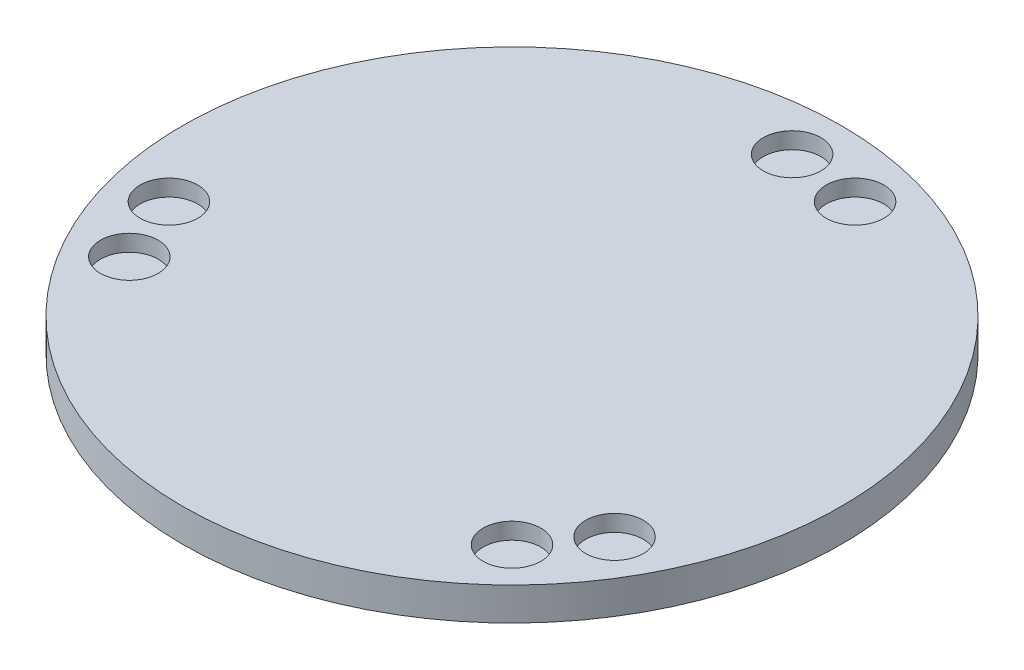
ISO-10303-21;
HEADER;
FILE_DESCRIPTION(('STEP AP214'),'2;1');
FILE_NAME('part.step','',(''),(''),'','','');
FILE_SCHEMA(('AUTOMOTIVE_DESIGN { 1 0 10303 214 1 1 1 1 }'));
ENDSEC;
DATA;
#1=APPLICATION_CONTEXT('core data for automotive mechanical design processes');
#2=APPLICATION_PROTOCOL_DEFINITION('international standard','automotive_design',2000,#1);
#3=PRODUCT_CONTEXT('',#1,'mechanical');
#4=PRODUCT('Part','Part','',(#3));
#5=PRODUCT_RELATED_PRODUCT_CATEGORY('part','',(#4));
#6=PRODUCT_DEFINITION_FORMATION('','',#4);
#7=PRODUCT_DEFINITION_CONTEXT('part definition',#1,'design');
#8=PRODUCT_DEFINITION('design','',#6,#7);
#9=PRODUCT_DEFINITION_SHAPE('','',#8);
#10=(LENGTH_UNIT() NAMED_UNIT(*) SI_UNIT(.MILLI.,.METRE.));
#11=(NAMED_UNIT(*) PLANE_ANGLE_UNIT() SI_UNIT($,.RADIAN.));
#12=(NAMED_UNIT(*) SI_UNIT($,.STERADIAN.) SOLID_ANGLE_UNIT());
#13=UNCERTAINTY_MEASURE_WITH_UNIT(LENGTH_MEASURE(1.E-05),#10,'distance_accuracy_value','');
#14=(GEOMETRIC_REPRESENTATION_CONTEXT(3) GLOBAL_UNCERTAINTY_ASSIGNED_CONTEXT((#13)) GLOBAL_UNIT_ASSIGNED_CONTEXT((#10,
#11,#12)) REPRESENTATION_CONTEXT('',''));
#15=CARTESIAN_POINT('',(0.,0.,0.));
#16=DIRECTION('',(0.,0.,1.));
#17=DIRECTION('',(1.,0.,0.));
#18=AXIS2_PLACEMENT_3D('',#15,#16,#17);
#19=CARTESIAN_POINT('',(0.,-20.,0.));
#20=DIRECTION('',(0.,1.,0.));
#21=DIRECTION('',(0.,0.,1.));
#22=AXIS2_PLACEMENT_3D('',#19,#20,#21);
#23=CYLINDRICAL_SURFACE('',#22,200.);
#24=CARTESIAN_POINT('',(0.,-20.,0.));
#25=DIRECTION('',(0.,1.,0.));
#26=DIRECTION('',(0.,0.,1.));
#27=AXIS2_PLACEMENT_3D('',#24,#25,#26);
#28=CIRCLE('',#27,200.);
#29=CARTESIAN_POINT('',(0.,-20.,200.));
#30=VERTEX_POINT('',#29);
#31=EDGE_CURVE('E11',#30,#30,#28,.T.);
#32=ORIENTED_EDGE('',*,*,#31,.T.);
#33=EDGE_LOOP('',(#32));
#34=FACE_BOUND('',#33,.T.);
#35=CARTESIAN_POINT('',(0.,0.,0.));
#36=DIRECTION('',(0.,1.,0.));
#37=DIRECTION('',(0.,0.,1.));
#38=AXIS2_PLACEMENT_3D('',#35,#36,#37);
#39=CIRCLE('',#38,200.);
#40=CARTESIAN_POINT('',(0.,0.,200.));
#41=VERTEX_POINT('',#40);
#42=EDGE_CURVE('E42',#41,#41,#39,.T.);
#43=ORIENTED_EDGE('',*,*,#42,.F.);
#44=EDGE_LOOP('',(#43));
#45=FACE_BOUND('',#44,.T.);
#46=ADVANCED_FACE('F39',(#34,#45),#23,.T.);
#47=CARTESIAN_POINT('',(0.,-20.,0.));
#48=DIRECTION('',(0.,1.,0.));
#49=DIRECTION('',(0.,0.,1.));
#50=AXIS2_PLACEMENT_3D('',#47,#48,#49);
#51=PLANE('',#50);
#52=ORIENTED_EDGE('',*,*,#31,.F.);
#53=EDGE_LOOP('',(#52));
#54=FACE_BOUND('',#53,.T.);
#55=ADVANCED_FACE('F100',(#54),#51,.F.);
#56=CARTESIAN_POINT('',(0.,0.,0.));
#57=DIRECTION('',(0.,1.,0.));
#58=DIRECTION('',(0.,0.,1.));
#59=AXIS2_PLACEMENT_3D('',#56,#57,#58);
#60=PLANE('',#59);
#61=CARTESIAN_POINT('',(-164.207390469139,0.,43.999237667431));
#62=DIRECTION('',(0.,1.,0.));
#63=DIRECTION('',(0.,0.,1.));
#64=AXIS2_PLACEMENT_3D('',#61,#62,#63);
#65=CIRCLE('',#64,17.5000000000053);
#66=CARTESIAN_POINT('',(-164.207390469139,0.,61.4992376674363));
#67=VERTEX_POINT('',#66);
#68=EDGE_CURVE('E90',#67,#67,#65,.T.);
#69=ORIENTED_EDGE('',*,*,#68,.F.);
#70=EDGE_LOOP('',(#69));
#71=FACE_BOUND('',#70,.T.);
#72=CARTESIAN_POINT('',(-147.224318643351,0.,85.0000000000026));
#73=DIRECTION('',(0.,1.,0.));
#74=DIRECTION('',(0.,0.,1.));
#75=AXIS2_PLACEMENT_3D('',#72,#73,#74);
#76=CIRCLE('',#75,17.5000000000055);
#77=CARTESIAN_POINT('',(-147.224318643351,0.,102.500000000008));
#78=VERTEX_POINT('',#77);
#79=EDGE_CURVE('E83',#78,#78,#76,.T.);
#80=ORIENTED_EDGE('',*,*,#79,.F.);
#81=EDGE_LOOP('',(#80));
#82=FACE_BOUND('',#81,.T.);
#83=CARTESIAN_POINT('',(120.208152801717,0.,120.208152801712));
#84=DIRECTION('',(0.,1.,0.));
#85=DIRECTION('',(0.,0.,1.));
#86=AXIS2_PLACEMENT_3D('',#83,#84,#85);
#87=CIRCLE('',#86,17.5000000000053);
#88=CARTESIAN_POINT('',(120.208152801717,0.,137.708152801717));
#89=VERTEX_POINT('',#88);
#90=EDGE_CURVE('E76',#89,#89,#87,.T.);
#91=ORIENTED_EDGE('',*,*,#90,.F.);
#92=EDGE_LOOP('',(#91));
#93=FACE_BOUND('',#92,.T.);
#94=CARTESIAN_POINT('',(147.224318643358,0.,84.9999999999985));
#95=DIRECTION('',(0.,1.,0.));
#96=DIRECTION('',(0.,0.,1.));
#97=AXIS2_PLACEMENT_3D('',#94,#95,#96);
#98=CIRCLE('',#97,17.5000000000031);
#99=CARTESIAN_POINT('',(147.224318643358,0.,102.500000000002));
#100=VERTEX_POINT('',#99);
#101=EDGE_CURVE('E69',#100,#100,#98,.T.);
#102=ORIENTED_EDGE('',*,*,#101,.F.);
#103=EDGE_LOOP('',(#102));
#104=FACE_BOUND('',#103,.T.);
#105=CARTESIAN_POINT('',(43.9992376674287,0.,-164.207390469142));
#106=DIRECTION('',(0.,1.,0.));
#107=DIRECTION('',(0.,0.,1.));
#108=AXIS2_PLACEMENT_3D('',#105,#106,#107);
#109=CIRCLE('',#108,17.5000000000053);
#110=CARTESIAN_POINT('',(43.9992376674287,0.,-146.707390469136));
#111=VERTEX_POINT('',#110);
#112=EDGE_CURVE('E62',#111,#111,#109,.T.);
#113=ORIENTED_EDGE('',*,*,#112,.F.);
#114=EDGE_LOOP('',(#113));
#115=FACE_BOUND('',#114,.T.);
#116=CARTESIAN_POINT('',(0.,0.,-170.));
#117=DIRECTION('',(0.,1.,0.));
#118=DIRECTION('',(0.,0.,1.));
#119=AXIS2_PLACEMENT_3D('',#116,#117,#118);
#120=CIRCLE('',#119,17.5);
#121=CARTESIAN_POINT('',(0.,0.,-152.5));
#122=VERTEX_POINT('',#121);
#123=EDGE_CURVE('E55',#122,#122,#120,.T.);
#124=ORIENTED_EDGE('',*,*,#123,.F.);
#125=EDGE_LOOP('',(#124));
#126=FACE_BOUND('',#125,.T.);
#127=ORIENTED_EDGE('',*,*,#42,.T.);
#128=EDGE_LOOP('',(#127));
#129=FACE_BOUND('',#128,.T.);
#130=ADVANCED_FACE('F96',(#71,#82,#93,#104,#115,#126,#129),#60,.T.);
#131=CARTESIAN_POINT('',(0.,-69.497474683074,-170.));
#132=DIRECTION('',(0.,1.,0.));
#133=DIRECTION('',(0.,0.,1.));
#134=AXIS2_PLACEMENT_3D('',#131,#132,#133);
#135=CYLINDRICAL_SURFACE('',#134,17.5);
#136=CARTESIAN_POINT('',(0.,-10.,-170.));
#137=DIRECTION('',(0.,1.,0.));
#138=DIRECTION('',(0.,0.,1.));
#139=AXIS2_PLACEMENT_3D('',#136,#137,#138);
#140=CIRCLE('',#139,17.5);
#141=CARTESIAN_POINT('',(0.,-10.,-152.5));
#142=VERTEX_POINT('',#141);
#143=EDGE_CURVE('E50',#142,#142,#140,.F.);
#144=ORIENTED_EDGE('',*,*,#143,.T.);
#145=EDGE_LOOP('',(#144));
#146=FACE_BOUND('',#145,.T.);
#147=ORIENTED_EDGE('',*,*,#123,.T.);
#148=EDGE_LOOP('',(#147));
#149=FACE_BOUND('',#148,.T.);
#150=ADVANCED_FACE('F99',(#146,#149),#135,.F.);
#151=CARTESIAN_POINT('',(0.,-10.,0.));
#152=DIRECTION('',(0.,1.,0.));
#153=DIRECTION('',(0.,0.,1.));
#154=AXIS2_PLACEMENT_3D('',#151,#152,#153);
#155=PLANE('',#154);
#156=ORIENTED_EDGE('',*,*,#143,.F.);
#157=EDGE_LOOP('',(#156));
#158=FACE_BOUND('',#157,.T.);
#159=ADVANCED_FACE('F124',(#158),#155,.T.);
#160=CARTESIAN_POINT('',(43.9992376674287,-69.497474683074,-164.207390469142));
#161=DIRECTION('',(0.,1.,0.));
#162=DIRECTION('',(0.,0.,1.));
#163=AXIS2_PLACEMENT_3D('',#160,#161,#162);
#164=CYLINDRICAL_SURFACE('',#163,17.5000000000053);
#165=CARTESIAN_POINT('',(43.9992376674287,-10.,-164.207390469142));
#166=DIRECTION('',(0.,1.,0.));
#167=DIRECTION('',(0.,0.,1.));
#168=AXIS2_PLACEMENT_3D('',#165,#166,#167);
#169=CIRCLE('',#168,17.5000000000053);
#170=CARTESIAN_POINT('',(43.9992376674287,-10.,-146.707390469136));
#171=VERTEX_POINT('',#170);
#172=EDGE_CURVE('E58',#171,#171,#169,.F.);
#173=ORIENTED_EDGE('',*,*,#172,.T.);
#174=EDGE_LOOP('',(#173));
#175=FACE_BOUND('',#174,.T.);
#176=ORIENTED_EDGE('',*,*,#112,.T.);
#177=EDGE_LOOP('',(#176));
#178=FACE_BOUND('',#177,.T.);
#179=ADVANCED_FACE('F128',(#175,#178),#164,.F.);
#180=CARTESIAN_POINT('',(0.,-10.,0.));
#181=DIRECTION('',(0.,1.,0.));
#182=DIRECTION('',(0.,0.,1.));
#183=AXIS2_PLACEMENT_3D('',#180,#181,#182);
#184=PLANE('',#183);
#185=ORIENTED_EDGE('',*,*,#172,.F.);
#186=EDGE_LOOP('',(#185));
#187=FACE_BOUND('',#186,.T.);
#188=ADVANCED_FACE('F132',(#187),#184,.T.);
#189=CARTESIAN_POINT('',(147.224318643358,-69.497474683074,84.9999999999985));
#190=DIRECTION('',(0.,1.,0.));
#191=DIRECTION('',(0.,0.,1.));
#192=AXIS2_PLACEMENT_3D('',#189,#190,#191);
#193=CYLINDRICAL_SURFACE('',#192,17.5000000000031);
#194=CARTESIAN_POINT('',(147.224318643358,-10.,84.9999999999985));
#195=DIRECTION('',(0.,1.,0.));
#196=DIRECTION('',(0.,0.,1.));
#197=AXIS2_PLACEMENT_3D('',#194,#195,#196);
#198=CIRCLE('',#197,17.5000000000031);
#199=CARTESIAN_POINT('',(147.224318643358,-10.,102.500000000002));
#200=VERTEX_POINT('',#199);
#201=EDGE_CURVE('E65',#200,#200,#198,.F.);
#202=ORIENTED_EDGE('',*,*,#201,.T.);
#203=EDGE_LOOP('',(#202));
#204=FACE_BOUND('',#203,.T.);
#205=ORIENTED_EDGE('',*,*,#101,.T.);
#206=EDGE_LOOP('',(#205));
#207=FACE_BOUND('',#206,.T.);
#208=ADVANCED_FACE('F136',(#204,#207),#193,.F.);
#209=CARTESIAN_POINT('',(0.,-10.,0.));
#210=DIRECTION('',(0.,1.,0.));
#211=DIRECTION('',(0.,0.,1.));
#212=AXIS2_PLACEMENT_3D('',#209,#210,#211);
#213=PLANE('',#212);
#214=ORIENTED_EDGE('',*,*,#201,.F.);
#215=EDGE_LOOP('',(#214));
#216=FACE_BOUND('',#215,.T.);
#217=ADVANCED_FACE('F140',(#216),#213,.T.);
#218=CARTESIAN_POINT('',(120.208152801717,-69.497474683074,120.208152801712));
#219=DIRECTION('',(0.,1.,0.));
#220=DIRECTION('',(0.,0.,1.));
#221=AXIS2_PLACEMENT_3D('',#218,#219,#220);
#222=CYLINDRICAL_SURFACE('',#221,17.5000000000053);
#223=CARTESIAN_POINT('',(120.208152801717,-10.,120.208152801712));
#224=DIRECTION('',(0.,1.,0.));
#225=DIRECTION('',(0.,0.,1.));
#226=AXIS2_PLACEMENT_3D('',#223,#224,#225);
#227=CIRCLE('',#226,17.5000000000053);
#228=CARTESIAN_POINT('',(120.208152801717,-10.,137.708152801717));
#229=VERTEX_POINT('',#228);
#230=EDGE_CURVE('E72',#229,#229,#227,.F.);
#231=ORIENTED_EDGE('',*,*,#230,.T.);
#232=EDGE_LOOP('',(#231));
#233=FACE_BOUND('',#232,.T.);
#234=ORIENTED_EDGE('',*,*,#90,.T.);
#235=EDGE_LOOP('',(#234));
#236=FACE_BOUND('',#235,.T.);
#237=ADVANCED_FACE('F144',(#233,#236),#222,.F.);
#238=CARTESIAN_POINT('',(0.,-10.,0.));
#239=DIRECTION('',(0.,1.,0.));
#240=DIRECTION('',(0.,0.,1.));
#241=AXIS2_PLACEMENT_3D('',#238,#239,#240);
#242=PLANE('',#241);
#243=ORIENTED_EDGE('',*,*,#230,.F.);
#244=EDGE_LOOP('',(#243));
#245=FACE_BOUND('',#244,.T.);
#246=ADVANCED_FACE('F148',(#245),#242,.T.);
#247=CARTESIAN_POINT('',(-147.224318643351,-69.497474683074,85.0000000000026));
#248=DIRECTION('',(0.,1.,0.));
#249=DIRECTION('',(0.,0.,1.));
#250=AXIS2_PLACEMENT_3D('',#247,#248,#249);
#251=CYLINDRICAL_SURFACE('',#250,17.5000000000055);
#252=CARTESIAN_POINT('',(-147.224318643351,-10.,85.0000000000026));
#253=DIRECTION('',(0.,1.,0.));
#254=DIRECTION('',(0.,0.,1.));
#255=AXIS2_PLACEMENT_3D('',#252,#253,#254);
#256=CIRCLE('',#255,17.5000000000055);
#257=CARTESIAN_POINT('',(-147.224318643351,-10.,102.500000000008));
#258=VERTEX_POINT('',#257);
#259=EDGE_CURVE('E79',#258,#258,#256,.F.);
#260=ORIENTED_EDGE('',*,*,#259,.T.);
#261=EDGE_LOOP('',(#260));
#262=FACE_BOUND('',#261,.T.);
#263=ORIENTED_EDGE('',*,*,#79,.T.);
#264=EDGE_LOOP('',(#263));
#265=FACE_BOUND('',#264,.T.);
#266=ADVANCED_FACE('F152',(#262,#265),#251,.F.);
#267=CARTESIAN_POINT('',(0.,-10.,0.));
#268=DIRECTION('',(0.,1.,0.));
#269=DIRECTION('',(0.,0.,1.));
#270=AXIS2_PLACEMENT_3D('',#267,#268,#269);
#271=PLANE('',#270);
#272=ORIENTED_EDGE('',*,*,#259,.F.);
#273=EDGE_LOOP('',(#272));
#274=FACE_BOUND('',#273,.T.);
#275=ADVANCED_FACE('F156',(#274),#271,.T.);
#276=CARTESIAN_POINT('',(-164.207390469139,-69.497474683074,43.999237667431));
#277=DIRECTION('',(0.,1.,0.));
#278=DIRECTION('',(0.,0.,1.));
#279=AXIS2_PLACEMENT_3D('',#276,#277,#278);
#280=CYLINDRICAL_SURFACE('',#279,17.5000000000053);
#281=CARTESIAN_POINT('',(-164.207390469139,-10.,43.999237667431));
#282=DIRECTION('',(0.,1.,0.));
#283=DIRECTION('',(0.,0.,1.));
#284=AXIS2_PLACEMENT_3D('',#281,#282,#283);
#285=CIRCLE('',#284,17.5000000000053);
#286=CARTESIAN_POINT('',(-164.207390469139,-10.,61.4992376674363));
#287=VERTEX_POINT('',#286);
#288=EDGE_CURVE('E86',#287,#287,#285,.F.);
#289=ORIENTED_EDGE('',*,*,#288,.T.);
#290=EDGE_LOOP('',(#289));
#291=FACE_BOUND('',#290,.T.);
#292=ORIENTED_EDGE('',*,*,#68,.T.);
#293=EDGE_LOOP('',(#292));
#294=FACE_BOUND('',#293,.T.);
#295=ADVANCED_FACE('F94',(#291,#294),#280,.F.);
#296=CARTESIAN_POINT('',(0.,-10.,0.));
#297=DIRECTION('',(0.,1.,0.));
#298=DIRECTION('',(0.,0.,1.));
#299=AXIS2_PLACEMENT_3D('',#296,#297,#298);
#300=PLANE('',#299);
#301=ORIENTED_EDGE('',*,*,#288,.F.);
#302=EDGE_LOOP('',(#301));
#303=FACE_BOUND('',#302,.T.);
#304=ADVANCED_FACE('F163',(#303),#300,.T.);
#305=CLOSED_SHELL('',(#46,#55,#130,#150,#159,#179,#188,#208,#217,#237,#246,#266,#275,#295,#304));
#306=MANIFOLD_SOLID_BREP('B2',#305);
#307=ADVANCED_BREP_SHAPE_REPRESENTATION('',(#18,#306),#14);
#308=SHAPE_DEFINITION_REPRESENTATION(#9,#307);
ENDSEC;
END-ISO-10303-21;
